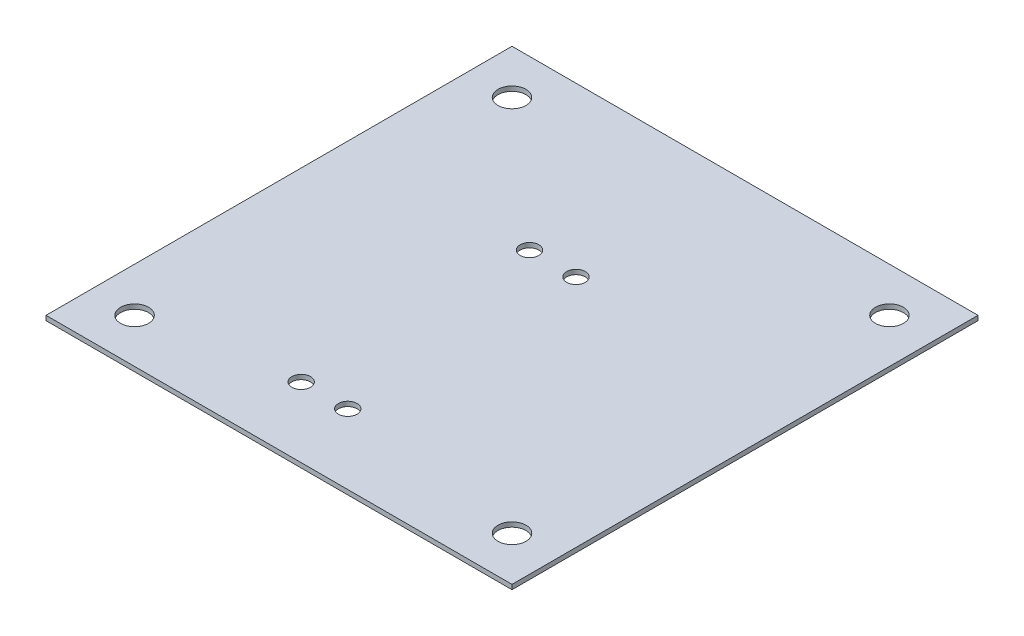
ISO-10303-21;
HEADER;
FILE_DESCRIPTION(('STEP AP214'),'2;1');
FILE_NAME('part.step','',(''),(''),'','','');
FILE_SCHEMA(('AUTOMOTIVE_DESIGN { 1 0 10303 214 1 1 1 1 }'));
ENDSEC;
DATA;
#1=APPLICATION_CONTEXT('core data for automotive mechanical design processes');
#2=APPLICATION_PROTOCOL_DEFINITION('international standard','automotive_design',2000,#1);
#3=PRODUCT_CONTEXT('',#1,'mechanical');
#4=PRODUCT('Part','Part','',(#3));
#5=PRODUCT_RELATED_PRODUCT_CATEGORY('part','',(#4));
#6=PRODUCT_DEFINITION_FORMATION('','',#4);
#7=PRODUCT_DEFINITION_CONTEXT('part definition',#1,'design');
#8=PRODUCT_DEFINITION('design','',#6,#7);
#9=PRODUCT_DEFINITION_SHAPE('','',#8);
#10=(LENGTH_UNIT() NAMED_UNIT(*) SI_UNIT(.MILLI.,.METRE.));
#11=(NAMED_UNIT(*) PLANE_ANGLE_UNIT() SI_UNIT($,.RADIAN.));
#12=(NAMED_UNIT(*) SI_UNIT($,.STERADIAN.) SOLID_ANGLE_UNIT());
#13=UNCERTAINTY_MEASURE_WITH_UNIT(LENGTH_MEASURE(1.E-05),#10,'distance_accuracy_value','');
#14=(GEOMETRIC_REPRESENTATION_CONTEXT(3) GLOBAL_UNCERTAINTY_ASSIGNED_CONTEXT((#13)) GLOBAL_UNIT_ASSIGNED_CONTEXT((#10,
#11,#12)) REPRESENTATION_CONTEXT('',''));
#15=CARTESIAN_POINT('',(0.,0.,0.));
#16=DIRECTION('',(0.,0.,1.));
#17=DIRECTION('',(1.,0.,0.));
#18=AXIS2_PLACEMENT_3D('',#15,#16,#17);
#19=CARTESIAN_POINT('',(-50.0000000000002,1.,-50.));
#20=DIRECTION('',(1.,0.,0.));
#21=DIRECTION('',(0.,0.,-1.));
#22=AXIS2_PLACEMENT_3D('',#19,#20,#21);
#23=PLANE('',#22);
#24=DIRECTION('',(0.,0.,1.));
#25=VECTOR('',#24,1.);
#26=CARTESIAN_POINT('',(-50.0000000000002,0.,-50.));
#27=LINE('',#26,#25);
#28=CARTESIAN_POINT('',(-50.0000000000002,0.,-50.));
#29=VERTEX_POINT('',#28);
#30=CARTESIAN_POINT('',(-50.0000000000002,0.,50.));
#31=VERTEX_POINT('',#30);
#32=EDGE_CURVE('E98',#29,#31,#27,.T.);
#33=ORIENTED_EDGE('',*,*,#32,.T.);
#34=DIRECTION('',(0.,-1.,0.));
#35=VECTOR('',#34,1.);
#36=CARTESIAN_POINT('',(-50.0000000000002,1.,50.));
#37=LINE('',#36,#35);
#38=CARTESIAN_POINT('',(-50.0000000000002,1.,50.));
#39=VERTEX_POINT('',#38);
#40=EDGE_CURVE('E11',#39,#31,#37,.T.);
#41=ORIENTED_EDGE('',*,*,#40,.F.);
#42=DIRECTION('',(0.,0.,1.));
#43=VECTOR('',#42,1.);
#44=CARTESIAN_POINT('',(-50.0000000000002,1.,-50.));
#45=LINE('',#44,#43);
#46=CARTESIAN_POINT('',(-50.0000000000002,1.,-50.));
#47=VERTEX_POINT('',#46);
#48=EDGE_CURVE('E86',#47,#39,#45,.T.);
#49=ORIENTED_EDGE('',*,*,#48,.F.);
#50=DIRECTION('',(0.,-1.,0.));
#51=VECTOR('',#50,1.);
#52=CARTESIAN_POINT('',(-50.0000000000002,1.,-50.));
#53=LINE('',#52,#51);
#54=EDGE_CURVE('E94',#47,#29,#53,.T.);
#55=ORIENTED_EDGE('',*,*,#54,.T.);
#56=EDGE_LOOP('',(#33,#41,#49,#55));
#57=FACE_BOUND('',#56,.T.);
#58=ADVANCED_FACE('F35',(#57),#23,.F.);
#59=CARTESIAN_POINT('',(50.0000000000002,1.,50.));
#60=DIRECTION('',(0.,0.,-1.));
#61=DIRECTION('',(-1.,0.,0.));
#62=AXIS2_PLACEMENT_3D('',#59,#60,#61);
#63=PLANE('',#62);
#64=DIRECTION('',(1.,0.,0.));
#65=VECTOR('',#64,1.);
#66=CARTESIAN_POINT('',(50.0000000000002,0.,50.));
#67=LINE('',#66,#65);
#68=CARTESIAN_POINT('',(50.0000000000002,0.,50.));
#69=VERTEX_POINT('',#68);
#70=EDGE_CURVE('E90',#31,#69,#67,.T.);
#71=ORIENTED_EDGE('',*,*,#70,.T.);
#72=DIRECTION('',(0.,-1.,0.));
#73=VECTOR('',#72,1.);
#74=CARTESIAN_POINT('',(50.0000000000002,1.,50.));
#75=LINE('',#74,#73);
#76=CARTESIAN_POINT('',(50.0000000000002,1.,50.));
#77=VERTEX_POINT('',#76);
#78=EDGE_CURVE('E43',#77,#69,#75,.T.);
#79=ORIENTED_EDGE('',*,*,#78,.F.);
#80=DIRECTION('',(1.,0.,0.));
#81=VECTOR('',#80,1.);
#82=CARTESIAN_POINT('',(50.0000000000002,1.,50.));
#83=LINE('',#82,#81);
#84=EDGE_CURVE('E81',#39,#77,#83,.T.);
#85=ORIENTED_EDGE('',*,*,#84,.F.);
#86=ORIENTED_EDGE('',*,*,#40,.T.);
#87=EDGE_LOOP('',(#71,#79,#85,#86));
#88=FACE_BOUND('',#87,.T.);
#89=ADVANCED_FACE('F89',(#88),#63,.F.);
#90=CARTESIAN_POINT('',(50.0000000000002,1.,-50.));
#91=DIRECTION('',(-1.,0.,0.));
#92=DIRECTION('',(0.,0.,1.));
#93=AXIS2_PLACEMENT_3D('',#90,#91,#92);
#94=PLANE('',#93);
#95=DIRECTION('',(0.,0.,-1.));
#96=VECTOR('',#95,1.);
#97=CARTESIAN_POINT('',(50.0000000000002,0.,-50.));
#98=LINE('',#97,#96);
#99=CARTESIAN_POINT('',(50.0000000000002,0.,-50.));
#100=VERTEX_POINT('',#99);
#101=EDGE_CURVE('E68',#69,#100,#98,.T.);
#102=ORIENTED_EDGE('',*,*,#101,.T.);
#103=DIRECTION('',(0.,-1.,0.));
#104=VECTOR('',#103,1.);
#105=CARTESIAN_POINT('',(50.0000000000002,1.,-50.));
#106=LINE('',#105,#104);
#107=CARTESIAN_POINT('',(50.0000000000002,1.,-50.));
#108=VERTEX_POINT('',#107);
#109=EDGE_CURVE('E91',#108,#100,#106,.T.);
#110=ORIENTED_EDGE('',*,*,#109,.F.);
#111=DIRECTION('',(0.,0.,-1.));
#112=VECTOR('',#111,1.);
#113=CARTESIAN_POINT('',(50.0000000000002,1.,-50.));
#114=LINE('',#113,#112);
#115=EDGE_CURVE('E84',#77,#108,#114,.T.);
#116=ORIENTED_EDGE('',*,*,#115,.F.);
#117=ORIENTED_EDGE('',*,*,#78,.T.);
#118=EDGE_LOOP('',(#102,#110,#116,#117));
#119=FACE_BOUND('',#118,.T.);
#120=ADVANCED_FACE('F92',(#119),#94,.F.);
#121=CARTESIAN_POINT('',(50.0000000000002,1.,-50.));
#122=DIRECTION('',(0.,0.,1.));
#123=DIRECTION('',(1.,0.,0.));
#124=AXIS2_PLACEMENT_3D('',#121,#122,#123);
#125=PLANE('',#124);
#126=DIRECTION('',(-1.,0.,0.));
#127=VECTOR('',#126,1.);
#128=CARTESIAN_POINT('',(50.0000000000002,0.,-50.));
#129=LINE('',#128,#127);
#130=EDGE_CURVE('E74',#100,#29,#129,.T.);
#131=ORIENTED_EDGE('',*,*,#130,.T.);
#132=ORIENTED_EDGE('',*,*,#54,.F.);
#133=DIRECTION('',(-1.,0.,0.));
#134=VECTOR('',#133,1.);
#135=CARTESIAN_POINT('',(50.0000000000002,1.,-50.));
#136=LINE('',#135,#134);
#137=EDGE_CURVE('E51',#108,#47,#136,.T.);
#138=ORIENTED_EDGE('',*,*,#137,.F.);
#139=ORIENTED_EDGE('',*,*,#109,.T.);
#140=EDGE_LOOP('',(#131,#132,#138,#139));
#141=FACE_BOUND('',#140,.T.);
#142=ADVANCED_FACE('F106',(#141),#125,.F.);
#143=CARTESIAN_POINT('',(0.,1.,0.));
#144=DIRECTION('',(0.,-1.,0.));
#145=DIRECTION('',(0.,0.,-1.));
#146=AXIS2_PLACEMENT_3D('',#143,#144,#145);
#147=PLANE('',#146);
#148=CARTESIAN_POINT('',(-10.2427184465961,1.,-13.9999999999995));
#149=DIRECTION('',(0.,1.,0.));
#150=DIRECTION('',(0.,0.,1.));
#151=AXIS2_PLACEMENT_3D('',#148,#149,#150);
#152=CIRCLE('',#151,2.);
#153=CARTESIAN_POINT('',(-10.2427184465961,1.,-11.9999999999995));
#154=VERTEX_POINT('',#153);
#155=EDGE_CURVE('E154',#154,#154,#152,.T.);
#156=ORIENTED_EDGE('',*,*,#155,.F.);
#157=EDGE_LOOP('',(#156));
#158=FACE_BOUND('',#157,.T.);
#159=CARTESIAN_POINT('',(-0.268679141903316,1.,-13.9999999999995));
#160=DIRECTION('',(0.,1.,0.));
#161=DIRECTION('',(0.,0.,1.));
#162=AXIS2_PLACEMENT_3D('',#159,#160,#161);
#163=CIRCLE('',#162,2.);
#164=CARTESIAN_POINT('',(-0.268679141903316,1.,-11.9999999999995));
#165=VERTEX_POINT('',#164);
#166=EDGE_CURVE('E148',#165,#165,#163,.T.);
#167=ORIENTED_EDGE('',*,*,#166,.F.);
#168=EDGE_LOOP('',(#167));
#169=FACE_BOUND('',#168,.T.);
#170=CARTESIAN_POINT('',(-0.242718446596151,1.,35.0000000000005));
#171=DIRECTION('',(0.,1.,0.));
#172=DIRECTION('',(0.,0.,1.));
#173=AXIS2_PLACEMENT_3D('',#170,#171,#172);
#174=CIRCLE('',#173,2.);
#175=CARTESIAN_POINT('',(-0.242718446596151,1.,37.0000000000005));
#176=VERTEX_POINT('',#175);
#177=EDGE_CURVE('E142',#176,#176,#174,.T.);
#178=ORIENTED_EDGE('',*,*,#177,.F.);
#179=EDGE_LOOP('',(#178));
#180=FACE_BOUND('',#179,.T.);
#181=CARTESIAN_POINT('',(-10.2427184465962,1.,35.0000000000005));
#182=DIRECTION('',(0.,1.,0.));
#183=DIRECTION('',(0.,0.,1.));
#184=AXIS2_PLACEMENT_3D('',#181,#182,#183);
#185=CIRCLE('',#184,2.);
#186=CARTESIAN_POINT('',(-10.2427184465962,1.,37.0000000000005));
#187=VERTEX_POINT('',#186);
#188=EDGE_CURVE('E136',#187,#187,#185,.T.);
#189=ORIENTED_EDGE('',*,*,#188,.F.);
#190=EDGE_LOOP('',(#189));
#191=FACE_BOUND('',#190,.T.);
#192=CARTESIAN_POINT('',(-40.4999999999974,1.,-40.5000000000049));
#193=DIRECTION('',(0.,1.,0.));
#194=DIRECTION('',(0.,0.,-1.));
#195=AXIS2_PLACEMENT_3D('',#192,#193,#194);
#196=CIRCLE('',#195,3.);
#197=CARTESIAN_POINT('',(-40.4999999999974,1.,-43.5000000000049));
#198=VERTEX_POINT('',#197);
#199=EDGE_CURVE('E131',#198,#198,#196,.T.);
#200=ORIENTED_EDGE('',*,*,#199,.F.);
#201=EDGE_LOOP('',(#200));
#202=FACE_BOUND('',#201,.T.);
#203=CARTESIAN_POINT('',(40.5000000000054,1.,-40.499999999997));
#204=DIRECTION('',(0.,1.,0.));
#205=DIRECTION('',(1.,0.,0.));
#206=AXIS2_PLACEMENT_3D('',#203,#204,#205);
#207=CIRCLE('',#206,3.);
#208=CARTESIAN_POINT('',(43.5000000000054,1.,-40.499999999997));
#209=VERTEX_POINT('',#208);
#210=EDGE_CURVE('E124',#209,#209,#207,.T.);
#211=ORIENTED_EDGE('',*,*,#210,.F.);
#212=EDGE_LOOP('',(#211));
#213=FACE_BOUND('',#212,.T.);
#214=CARTESIAN_POINT('',(-40.5000000000051,1.,40.4999999999973));
#215=DIRECTION('',(0.,1.,0.));
#216=DIRECTION('',(-1.,0.,0.));
#217=AXIS2_PLACEMENT_3D('',#214,#215,#216);
#218=CIRCLE('',#217,3.);
#219=CARTESIAN_POINT('',(-43.5000000000051,1.,40.4999999999973));
#220=VERTEX_POINT('',#219);
#221=EDGE_CURVE('E118',#220,#220,#218,.T.);
#222=ORIENTED_EDGE('',*,*,#221,.F.);
#223=EDGE_LOOP('',(#222));
#224=FACE_BOUND('',#223,.T.);
#225=CARTESIAN_POINT('',(40.4999999999974,1.,40.5000000000049));
#226=DIRECTION('',(0.,1.,0.));
#227=DIRECTION('',(0.,0.,1.));
#228=AXIS2_PLACEMENT_3D('',#225,#226,#227);
#229=CIRCLE('',#228,3.);
#230=CARTESIAN_POINT('',(40.4999999999974,1.,43.5000000000049));
#231=VERTEX_POINT('',#230);
#232=EDGE_CURVE('E112',#231,#231,#229,.T.);
#233=ORIENTED_EDGE('',*,*,#232,.F.);
#234=EDGE_LOOP('',(#233));
#235=FACE_BOUND('',#234,.T.);
#236=ORIENTED_EDGE('',*,*,#48,.T.);
#237=ORIENTED_EDGE('',*,*,#84,.T.);
#238=ORIENTED_EDGE('',*,*,#115,.T.);
#239=ORIENTED_EDGE('',*,*,#137,.T.);
#240=EDGE_LOOP('',(#236,#237,#238,#239));
#241=FACE_BOUND('',#240,.T.);
#242=ADVANCED_FACE('F82',(#158,#169,#180,#191,#202,#213,#224,#235,#241),#147,.F.);
#243=CARTESIAN_POINT('',(0.,0.,0.));
#244=DIRECTION('',(0.,-1.,0.));
#245=DIRECTION('',(0.,0.,-1.));
#246=AXIS2_PLACEMENT_3D('',#243,#244,#245);
#247=PLANE('',#246);
#248=CARTESIAN_POINT('',(-10.2427184465961,0.,-13.9999999999995));
#249=DIRECTION('',(0.,1.,0.));
#250=DIRECTION('',(0.,0.,1.));
#251=AXIS2_PLACEMENT_3D('',#248,#249,#250);
#252=CIRCLE('',#251,2.);
#253=CARTESIAN_POINT('',(-10.2427184465961,0.,-11.9999999999995));
#254=VERTEX_POINT('',#253);
#255=EDGE_CURVE('E151',#254,#254,#252,.T.);
#256=ORIENTED_EDGE('',*,*,#255,.T.);
#257=EDGE_LOOP('',(#256));
#258=FACE_BOUND('',#257,.T.);
#259=CARTESIAN_POINT('',(-0.268679141903316,0.,-13.9999999999995));
#260=DIRECTION('',(0.,1.,0.));
#261=DIRECTION('',(0.,0.,1.));
#262=AXIS2_PLACEMENT_3D('',#259,#260,#261);
#263=CIRCLE('',#262,2.);
#264=CARTESIAN_POINT('',(-0.268679141903316,0.,-11.9999999999995));
#265=VERTEX_POINT('',#264);
#266=EDGE_CURVE('E145',#265,#265,#263,.T.);
#267=ORIENTED_EDGE('',*,*,#266,.T.);
#268=EDGE_LOOP('',(#267));
#269=FACE_BOUND('',#268,.T.);
#270=CARTESIAN_POINT('',(-0.242718446596151,0.,35.0000000000005));
#271=DIRECTION('',(0.,1.,0.));
#272=DIRECTION('',(0.,0.,1.));
#273=AXIS2_PLACEMENT_3D('',#270,#271,#272);
#274=CIRCLE('',#273,2.);
#275=CARTESIAN_POINT('',(-0.242718446596151,0.,37.0000000000005));
#276=VERTEX_POINT('',#275);
#277=EDGE_CURVE('E139',#276,#276,#274,.T.);
#278=ORIENTED_EDGE('',*,*,#277,.T.);
#279=EDGE_LOOP('',(#278));
#280=FACE_BOUND('',#279,.T.);
#281=CARTESIAN_POINT('',(-10.2427184465962,0.,35.0000000000005));
#282=DIRECTION('',(0.,1.,0.));
#283=DIRECTION('',(0.,0.,1.));
#284=AXIS2_PLACEMENT_3D('',#281,#282,#283);
#285=CIRCLE('',#284,2.);
#286=CARTESIAN_POINT('',(-10.2427184465962,0.,37.0000000000005));
#287=VERTEX_POINT('',#286);
#288=EDGE_CURVE('E128',#287,#287,#285,.T.);
#289=ORIENTED_EDGE('',*,*,#288,.T.);
#290=EDGE_LOOP('',(#289));
#291=FACE_BOUND('',#290,.T.);
#292=CARTESIAN_POINT('',(-40.4999999999974,0.,-40.5000000000049));
#293=DIRECTION('',(0.,1.,0.));
#294=DIRECTION('',(0.,0.,-1.));
#295=AXIS2_PLACEMENT_3D('',#292,#293,#294);
#296=CIRCLE('',#295,3.);
#297=CARTESIAN_POINT('',(-40.4999999999974,0.,-43.5000000000049));
#298=VERTEX_POINT('',#297);
#299=EDGE_CURVE('E121',#298,#298,#296,.T.);
#300=ORIENTED_EDGE('',*,*,#299,.T.);
#301=EDGE_LOOP('',(#300));
#302=FACE_BOUND('',#301,.T.);
#303=CARTESIAN_POINT('',(40.5000000000054,0.,-40.499999999997));
#304=DIRECTION('',(0.,1.,0.));
#305=DIRECTION('',(1.,0.,0.));
#306=AXIS2_PLACEMENT_3D('',#303,#304,#305);
#307=CIRCLE('',#306,3.);
#308=CARTESIAN_POINT('',(43.5000000000054,0.,-40.499999999997));
#309=VERTEX_POINT('',#308);
#310=EDGE_CURVE('E127',#309,#309,#307,.T.);
#311=ORIENTED_EDGE('',*,*,#310,.T.);
#312=EDGE_LOOP('',(#311));
#313=FACE_BOUND('',#312,.T.);
#314=CARTESIAN_POINT('',(-40.5000000000051,0.,40.4999999999973));
#315=DIRECTION('',(0.,1.,0.));
#316=DIRECTION('',(-1.,0.,0.));
#317=AXIS2_PLACEMENT_3D('',#314,#315,#316);
#318=CIRCLE('',#317,3.);
#319=CARTESIAN_POINT('',(-43.5000000000051,0.,40.4999999999973));
#320=VERTEX_POINT('',#319);
#321=EDGE_CURVE('E115',#320,#320,#318,.T.);
#322=ORIENTED_EDGE('',*,*,#321,.T.);
#323=EDGE_LOOP('',(#322));
#324=FACE_BOUND('',#323,.T.);
#325=CARTESIAN_POINT('',(40.4999999999974,0.,40.5000000000049));
#326=DIRECTION('',(0.,1.,0.));
#327=DIRECTION('',(0.,0.,1.));
#328=AXIS2_PLACEMENT_3D('',#325,#326,#327);
#329=CIRCLE('',#328,3.);
#330=CARTESIAN_POINT('',(40.4999999999974,0.,43.5000000000049));
#331=VERTEX_POINT('',#330);
#332=EDGE_CURVE('E101',#331,#331,#329,.T.);
#333=ORIENTED_EDGE('',*,*,#332,.T.);
#334=EDGE_LOOP('',(#333));
#335=FACE_BOUND('',#334,.T.);
#336=ORIENTED_EDGE('',*,*,#32,.F.);
#337=ORIENTED_EDGE('',*,*,#130,.F.);
#338=ORIENTED_EDGE('',*,*,#101,.F.);
#339=ORIENTED_EDGE('',*,*,#70,.F.);
#340=EDGE_LOOP('',(#336,#337,#338,#339));
#341=FACE_BOUND('',#340,.T.);
#342=ADVANCED_FACE('F109',(#258,#269,#280,#291,#302,#313,#324,#335,#341),#247,.T.);
#343=CARTESIAN_POINT('',(40.4999999999974,0.,40.5000000000049));
#344=DIRECTION('',(0.,1.,0.));
#345=DIRECTION('',(0.,0.,1.));
#346=AXIS2_PLACEMENT_3D('',#343,#344,#345);
#347=CYLINDRICAL_SURFACE('',#346,3.);
#348=ORIENTED_EDGE('',*,*,#332,.F.);
#349=EDGE_LOOP('',(#348));
#350=FACE_BOUND('',#349,.T.);
#351=ORIENTED_EDGE('',*,*,#232,.T.);
#352=EDGE_LOOP('',(#351));
#353=FACE_BOUND('',#352,.T.);
#354=ADVANCED_FACE('F186',(#350,#353),#347,.F.);
#355=CARTESIAN_POINT('',(-40.5000000000051,0.,40.4999999999973));
#356=DIRECTION('',(0.,1.,0.));
#357=DIRECTION('',(-1.,0.,0.));
#358=AXIS2_PLACEMENT_3D('',#355,#356,#357);
#359=CYLINDRICAL_SURFACE('',#358,3.);
#360=ORIENTED_EDGE('',*,*,#321,.F.);
#361=EDGE_LOOP('',(#360));
#362=FACE_BOUND('',#361,.T.);
#363=ORIENTED_EDGE('',*,*,#221,.T.);
#364=EDGE_LOOP('',(#363));
#365=FACE_BOUND('',#364,.T.);
#366=ADVANCED_FACE('F188',(#362,#365),#359,.F.);
#367=CARTESIAN_POINT('',(40.5000000000054,0.,-40.499999999997));
#368=DIRECTION('',(0.,1.,0.));
#369=DIRECTION('',(0.,0.,1.));
#370=AXIS2_PLACEMENT_3D('',#367,#368,#369);
#371=CYLINDRICAL_SURFACE('',#370,3.);
#372=ORIENTED_EDGE('',*,*,#310,.F.);
#373=EDGE_LOOP('',(#372));
#374=FACE_BOUND('',#373,.T.);
#375=ORIENTED_EDGE('',*,*,#210,.T.);
#376=EDGE_LOOP('',(#375));
#377=FACE_BOUND('',#376,.T.);
#378=ADVANCED_FACE('F195',(#374,#377),#371,.F.);
#379=CARTESIAN_POINT('',(-40.4999999999974,0.,-40.5000000000049));
#380=DIRECTION('',(0.,1.,0.));
#381=DIRECTION('',(0.,0.,1.));
#382=AXIS2_PLACEMENT_3D('',#379,#380,#381);
#383=CYLINDRICAL_SURFACE('',#382,3.);
#384=ORIENTED_EDGE('',*,*,#299,.F.);
#385=EDGE_LOOP('',(#384));
#386=FACE_BOUND('',#385,.T.);
#387=ORIENTED_EDGE('',*,*,#199,.T.);
#388=EDGE_LOOP('',(#387));
#389=FACE_BOUND('',#388,.T.);
#390=ADVANCED_FACE('F253',(#386,#389),#383,.F.);
#391=CARTESIAN_POINT('',(-10.2427184465962,0.,35.0000000000005));
#392=DIRECTION('',(0.,1.,0.));
#393=DIRECTION('',(0.,0.,1.));
#394=AXIS2_PLACEMENT_3D('',#391,#392,#393);
#395=CYLINDRICAL_SURFACE('',#394,2.);
#396=ORIENTED_EDGE('',*,*,#288,.F.);
#397=EDGE_LOOP('',(#396));
#398=FACE_BOUND('',#397,.T.);
#399=ORIENTED_EDGE('',*,*,#188,.T.);
#400=EDGE_LOOP('',(#399));
#401=FACE_BOUND('',#400,.T.);
#402=ADVANCED_FACE('F245',(#398,#401),#395,.F.);
#403=CARTESIAN_POINT('',(-0.242718446596151,0.,35.0000000000005));
#404=DIRECTION('',(0.,1.,0.));
#405=DIRECTION('',(0.,0.,1.));
#406=AXIS2_PLACEMENT_3D('',#403,#404,#405);
#407=CYLINDRICAL_SURFACE('',#406,2.);
#408=ORIENTED_EDGE('',*,*,#277,.F.);
#409=EDGE_LOOP('',(#408));
#410=FACE_BOUND('',#409,.T.);
#411=ORIENTED_EDGE('',*,*,#177,.T.);
#412=EDGE_LOOP('',(#411));
#413=FACE_BOUND('',#412,.T.);
#414=ADVANCED_FACE('F238',(#410,#413),#407,.F.);
#415=CARTESIAN_POINT('',(-0.268679141903316,0.,-13.9999999999995));
#416=DIRECTION('',(0.,1.,0.));
#417=DIRECTION('',(0.,0.,1.));
#418=AXIS2_PLACEMENT_3D('',#415,#416,#417);
#419=CYLINDRICAL_SURFACE('',#418,2.);
#420=ORIENTED_EDGE('',*,*,#266,.F.);
#421=EDGE_LOOP('',(#420));
#422=FACE_BOUND('',#421,.T.);
#423=ORIENTED_EDGE('',*,*,#166,.T.);
#424=EDGE_LOOP('',(#423));
#425=FACE_BOUND('',#424,.T.);
#426=ADVANCED_FACE('F165',(#422,#425),#419,.F.);
#427=CARTESIAN_POINT('',(-10.2427184465961,0.,-13.9999999999995));
#428=DIRECTION('',(0.,1.,0.));
#429=DIRECTION('',(0.,0.,1.));
#430=AXIS2_PLACEMENT_3D('',#427,#428,#429);
#431=CYLINDRICAL_SURFACE('',#430,2.);
#432=ORIENTED_EDGE('',*,*,#255,.F.);
#433=EDGE_LOOP('',(#432));
#434=FACE_BOUND('',#433,.T.);
#435=ORIENTED_EDGE('',*,*,#155,.T.);
#436=EDGE_LOOP('',(#435));
#437=FACE_BOUND('',#436,.T.);
#438=ADVANCED_FACE('F162',(#434,#437),#431,.F.);
#439=CLOSED_SHELL('',(#58,#89,#120,#142,#242,#342,#354,#366,#378,#390,#402,#414,#426,#438));
#440=MANIFOLD_SOLID_BREP('B2',#439);
#441=ADVANCED_BREP_SHAPE_REPRESENTATION('',(#18,#440),#14);
#442=SHAPE_DEFINITION_REPRESENTATION(#9,#441);
ENDSEC;
END-ISO-10303-21;
